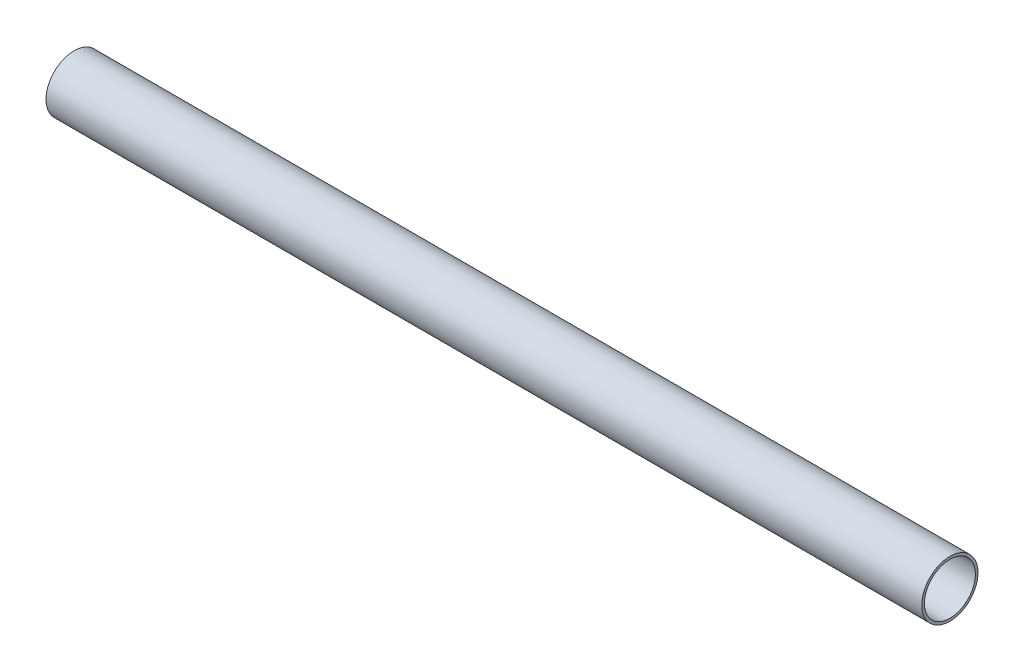
ISO-10303-21;
HEADER;
FILE_DESCRIPTION(('STEP AP214'),'2;1');
FILE_NAME('part.step','',(''),(''),'','','');
FILE_SCHEMA(('AUTOMOTIVE_DESIGN { 1 0 10303 214 1 1 1 1 }'));
ENDSEC;
DATA;
#1=APPLICATION_CONTEXT('core data for automotive mechanical design processes');
#2=APPLICATION_PROTOCOL_DEFINITION('international standard','automotive_design',2000,#1);
#3=PRODUCT_CONTEXT('',#1,'mechanical');
#4=PRODUCT('Part','Part','',(#3));
#5=PRODUCT_RELATED_PRODUCT_CATEGORY('part','',(#4));
#6=PRODUCT_DEFINITION_FORMATION('','',#4);
#7=PRODUCT_DEFINITION_CONTEXT('part definition',#1,'design');
#8=PRODUCT_DEFINITION('design','',#6,#7);
#9=PRODUCT_DEFINITION_SHAPE('','',#8);
#10=(LENGTH_UNIT() NAMED_UNIT(*) SI_UNIT(.MILLI.,.METRE.));
#11=(NAMED_UNIT(*) PLANE_ANGLE_UNIT() SI_UNIT($,.RADIAN.));
#12=(NAMED_UNIT(*) SI_UNIT($,.STERADIAN.) SOLID_ANGLE_UNIT());
#13=UNCERTAINTY_MEASURE_WITH_UNIT(LENGTH_MEASURE(1.E-05),#10,'distance_accuracy_value','');
#14=(GEOMETRIC_REPRESENTATION_CONTEXT(3) GLOBAL_UNCERTAINTY_ASSIGNED_CONTEXT((#13)) GLOBAL_UNIT_ASSIGNED_CONTEXT((#10,
#11,#12)) REPRESENTATION_CONTEXT('',''));
#15=CARTESIAN_POINT('',(0.,0.,0.));
#16=DIRECTION('',(0.,0.,1.));
#17=DIRECTION('',(1.,0.,0.));
#18=AXIS2_PLACEMENT_3D('',#15,#16,#17);
#19=CARTESIAN_POINT('',(0.,0.,0.));
#20=DIRECTION('',(1.,0.,0.));
#21=DIRECTION('',(0.,0.,-1.));
#22=AXIS2_PLACEMENT_3D('',#19,#20,#21);
#23=PLANE('',#22);
#24=CARTESIAN_POINT('',(0.,0.,0.));
#25=DIRECTION('',(1.,0.,0.));
#26=DIRECTION('',(0.,0.,-1.));
#27=AXIS2_PLACEMENT_3D('',#24,#25,#26);
#28=CIRCLE('',#27,9.525);
#29=CARTESIAN_POINT('',(0.,0.,-9.525));
#30=VERTEX_POINT('',#29);
#31=EDGE_CURVE('E41',#30,#30,#28,.T.);
#32=ORIENTED_EDGE('',*,*,#31,.F.);
#33=EDGE_LOOP('',(#32));
#34=FACE_BOUND('',#33,.T.);
#35=CARTESIAN_POINT('',(0.,0.,0.));
#36=DIRECTION('',(1.,0.,0.));
#37=DIRECTION('',(0.,0.,-1.));
#38=AXIS2_PLACEMENT_3D('',#35,#36,#37);
#39=CIRCLE('',#38,8.636);
#40=CARTESIAN_POINT('',(0.,0.,-8.636));
#41=VERTEX_POINT('',#40);
#42=EDGE_CURVE('E51',#41,#41,#39,.T.);
#43=ORIENTED_EDGE('',*,*,#42,.T.);
#44=EDGE_LOOP('',(#43));
#45=FACE_BOUND('',#44,.T.);
#46=ADVANCED_FACE('F37',(#34,#45),#23,.F.);
#47=CARTESIAN_POINT('',(323.556687158377,0.,0.));
#48=DIRECTION('',(-1.,0.,0.));
#49=DIRECTION('',(0.,0.,1.));
#50=AXIS2_PLACEMENT_3D('',#47,#48,#49);
#51=CYLINDRICAL_SURFACE('',#50,9.525);
#52=CARTESIAN_POINT('',(296.615918795169,0.,1.11022302462516E-13));
#53=DIRECTION('',(-1.,0.,0.));
#54=DIRECTION('',(0.,0.752092118171601,0.659057998801437));
#55=AXIS2_PLACEMENT_3D('',#52,#53,#54);
#56=CIRCLE('',#55,9.525);
#57=CARTESIAN_POINT('',(296.615918795169,7.16367742558447,6.2775274385838));
#58=VERTEX_POINT('',#57);
#59=EDGE_CURVE('E10',#58,#58,#56,.T.);
#60=ORIENTED_EDGE('',*,*,#59,.T.);
#61=EDGE_LOOP('',(#60));
#62=FACE_BOUND('',#61,.T.);
#63=ORIENTED_EDGE('',*,*,#31,.T.);
#64=EDGE_LOOP('',(#63));
#65=FACE_BOUND('',#64,.T.);
#66=ADVANCED_FACE('F39',(#62,#65),#51,.T.);
#67=CARTESIAN_POINT('',(323.556687158377,0.,0.));
#68=DIRECTION('',(-1.,0.,0.));
#69=DIRECTION('',(0.,0.,1.));
#70=AXIS2_PLACEMENT_3D('',#67,#68,#69);
#71=CYLINDRICAL_SURFACE('',#70,8.636);
#72=CARTESIAN_POINT('',(296.615918795169,0.,1.11022302462516E-13));
#73=DIRECTION('',(-1.,0.,0.));
#74=DIRECTION('',(0.,0.752092118171601,0.659057998801437));
#75=AXIS2_PLACEMENT_3D('',#72,#73,#74);
#76=CIRCLE('',#75,8.636);
#77=CARTESIAN_POINT('',(296.615918795169,6.49506753252992,5.69162487764932));
#78=VERTEX_POINT('',#77);
#79=EDGE_CURVE('E45',#78,#78,#76,.T.);
#80=ORIENTED_EDGE('',*,*,#79,.F.);
#81=EDGE_LOOP('',(#80));
#82=FACE_BOUND('',#81,.T.);
#83=ORIENTED_EDGE('',*,*,#42,.F.);
#84=EDGE_LOOP('',(#83));
#85=FACE_BOUND('',#84,.T.);
#86=ADVANCED_FACE('F63',(#82,#85),#71,.F.);
#87=CARTESIAN_POINT('',(296.615918795169,0.,1.11022302462516E-13));
#88=DIRECTION('',(-1.,0.,0.));
#89=DIRECTION('',(0.,0.752092118171601,0.659057998801437));
#90=AXIS2_PLACEMENT_3D('',#87,#88,#89);
#91=PLANE('',#90);
#92=ORIENTED_EDGE('',*,*,#79,.T.);
#93=EDGE_LOOP('',(#92));
#94=FACE_BOUND('',#93,.T.);
#95=ORIENTED_EDGE('',*,*,#59,.F.);
#96=EDGE_LOOP('',(#95));
#97=FACE_BOUND('',#96,.T.);
#98=ADVANCED_FACE('F67',(#94,#97),#91,.F.);
#99=CLOSED_SHELL('',(#46,#66,#86,#98));
#100=MANIFOLD_SOLID_BREP('B2',#99);
#101=ADVANCED_BREP_SHAPE_REPRESENTATION('',(#18,#100),#14);
#102=SHAPE_DEFINITION_REPRESENTATION(#9,#101);
ENDSEC;
END-ISO-10303-21;
